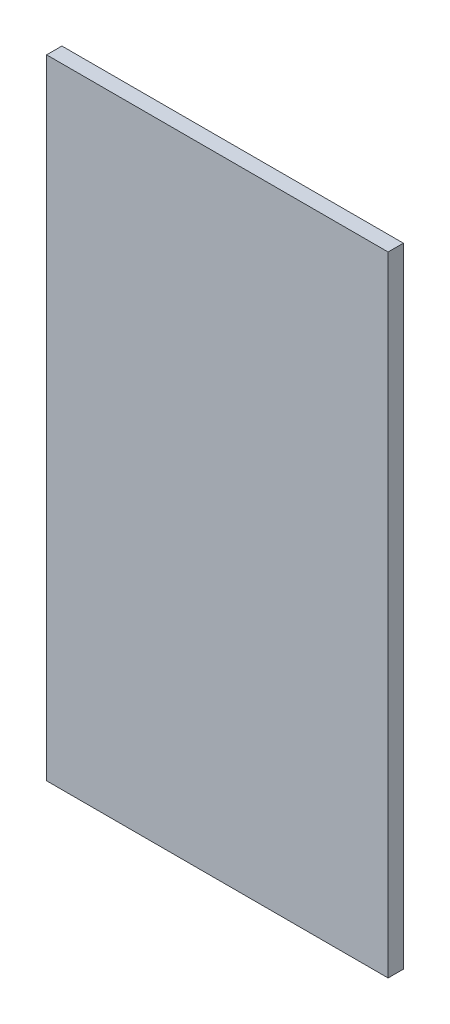
ISO-10303-21;
HEADER;
FILE_DESCRIPTION(('STEP AP214'),'2;1');
FILE_NAME('part.step','',(''),(''),'','','');
FILE_SCHEMA(('AUTOMOTIVE_DESIGN { 1 0 10303 214 1 1 1 1 }'));
ENDSEC;
DATA;
#1=APPLICATION_CONTEXT('core data for automotive mechanical design processes');
#2=APPLICATION_PROTOCOL_DEFINITION('international standard','automotive_design',2000,#1);
#3=PRODUCT_CONTEXT('',#1,'mechanical');
#4=PRODUCT('Part','Part','',(#3));
#5=PRODUCT_RELATED_PRODUCT_CATEGORY('part','',(#4));
#6=PRODUCT_DEFINITION_FORMATION('','',#4);
#7=PRODUCT_DEFINITION_CONTEXT('part definition',#1,'design');
#8=PRODUCT_DEFINITION('design','',#6,#7);
#9=PRODUCT_DEFINITION_SHAPE('','',#8);
#10=(LENGTH_UNIT() NAMED_UNIT(*) SI_UNIT(.MILLI.,.METRE.));
#11=(NAMED_UNIT(*) PLANE_ANGLE_UNIT() SI_UNIT($,.RADIAN.));
#12=(NAMED_UNIT(*) SI_UNIT($,.STERADIAN.) SOLID_ANGLE_UNIT());
#13=UNCERTAINTY_MEASURE_WITH_UNIT(LENGTH_MEASURE(1.E-05),#10,'distance_accuracy_value','');
#14=(GEOMETRIC_REPRESENTATION_CONTEXT(3) GLOBAL_UNCERTAINTY_ASSIGNED_CONTEXT((#13)) GLOBAL_UNIT_ASSIGNED_CONTEXT((#10,
#11,#12)) REPRESENTATION_CONTEXT('',''));
#15=CARTESIAN_POINT('',(0.,0.,0.));
#16=DIRECTION('',(0.,0.,1.));
#17=DIRECTION('',(1.,0.,0.));
#18=AXIS2_PLACEMENT_3D('',#15,#16,#17);
#19=CARTESIAN_POINT('',(0.,0.,-20.));
#20=DIRECTION('',(-1.,0.,0.));
#21=DIRECTION('',(0.,0.,1.));
#22=AXIS2_PLACEMENT_3D('',#19,#20,#21);
#23=PLANE('',#22);
#24=DIRECTION('',(0.,-1.,0.));
#25=VECTOR('',#24,1.);
#26=CARTESIAN_POINT('',(0.,0.,0.));
#27=LINE('',#26,#25);
#28=CARTESIAN_POINT('',(0.,823.,0.));
#29=VERTEX_POINT('',#28);
#30=CARTESIAN_POINT('',(0.,0.,0.));
#31=VERTEX_POINT('',#30);
#32=EDGE_CURVE('E96',#29,#31,#27,.T.);
#33=ORIENTED_EDGE('',*,*,#32,.F.);
#34=DIRECTION('',(0.,0.,1.));
#35=VECTOR('',#34,1.);
#36=CARTESIAN_POINT('',(0.,823.,-20.));
#37=LINE('',#36,#35);
#38=CARTESIAN_POINT('',(0.,823.,-20.));
#39=VERTEX_POINT('',#38);
#40=EDGE_CURVE('E11',#39,#29,#37,.T.);
#41=ORIENTED_EDGE('',*,*,#40,.F.);
#42=DIRECTION('',(0.,-1.,0.));
#43=VECTOR('',#42,1.);
#44=CARTESIAN_POINT('',(0.,0.,-20.));
#45=LINE('',#44,#43);
#46=CARTESIAN_POINT('',(0.,0.,-20.));
#47=VERTEX_POINT('',#46);
#48=EDGE_CURVE('E90',#39,#47,#45,.T.);
#49=ORIENTED_EDGE('',*,*,#48,.T.);
#50=DIRECTION('',(0.,0.,1.));
#51=VECTOR('',#50,1.);
#52=CARTESIAN_POINT('',(0.,0.,-20.));
#53=LINE('',#52,#51);
#54=EDGE_CURVE('E35',#47,#31,#53,.T.);
#55=ORIENTED_EDGE('',*,*,#54,.T.);
#56=EDGE_LOOP('',(#33,#41,#49,#55));
#57=FACE_BOUND('',#56,.T.);
#58=ADVANCED_FACE('F32',(#57),#23,.T.);
#59=CARTESIAN_POINT('',(0.,823.,-20.));
#60=DIRECTION('',(0.,1.,0.));
#61=DIRECTION('',(0.,0.,1.));
#62=AXIS2_PLACEMENT_3D('',#59,#60,#61);
#63=PLANE('',#62);
#64=DIRECTION('',(-1.,0.,0.));
#65=VECTOR('',#64,1.);
#66=CARTESIAN_POINT('',(0.,823.,0.));
#67=LINE('',#66,#65);
#68=CARTESIAN_POINT('',(447.,823.,0.));
#69=VERTEX_POINT('',#68);
#70=EDGE_CURVE('E92',#69,#29,#67,.T.);
#71=ORIENTED_EDGE('',*,*,#70,.F.);
#72=DIRECTION('',(0.,0.,1.));
#73=VECTOR('',#72,1.);
#74=CARTESIAN_POINT('',(447.,823.,-20.));
#75=LINE('',#74,#73);
#76=CARTESIAN_POINT('',(447.,823.,-20.));
#77=VERTEX_POINT('',#76);
#78=EDGE_CURVE('E41',#77,#69,#75,.T.);
#79=ORIENTED_EDGE('',*,*,#78,.F.);
#80=DIRECTION('',(-1.,0.,0.));
#81=VECTOR('',#80,1.);
#82=CARTESIAN_POINT('',(0.,823.,-20.));
#83=LINE('',#82,#81);
#84=EDGE_CURVE('E87',#77,#39,#83,.T.);
#85=ORIENTED_EDGE('',*,*,#84,.T.);
#86=ORIENTED_EDGE('',*,*,#40,.T.);
#87=EDGE_LOOP('',(#71,#79,#85,#86));
#88=FACE_BOUND('',#87,.T.);
#89=ADVANCED_FACE('F106',(#88),#63,.T.);
#90=CARTESIAN_POINT('',(447.,0.,-20.));
#91=DIRECTION('',(1.,0.,0.));
#92=DIRECTION('',(0.,0.,-1.));
#93=AXIS2_PLACEMENT_3D('',#90,#91,#92);
#94=PLANE('',#93);
#95=DIRECTION('',(0.,1.,0.));
#96=VECTOR('',#95,1.);
#97=CARTESIAN_POINT('',(447.,0.,0.));
#98=LINE('',#97,#96);
#99=CARTESIAN_POINT('',(447.,0.,0.));
#100=VERTEX_POINT('',#99);
#101=EDGE_CURVE('E82',#100,#69,#98,.T.);
#102=ORIENTED_EDGE('',*,*,#101,.F.);
#103=DIRECTION('',(0.,0.,1.));
#104=VECTOR('',#103,1.);
#105=CARTESIAN_POINT('',(447.,0.,-20.));
#106=LINE('',#105,#104);
#107=CARTESIAN_POINT('',(447.,0.,-20.));
#108=VERTEX_POINT('',#107);
#109=EDGE_CURVE('E77',#108,#100,#106,.T.);
#110=ORIENTED_EDGE('',*,*,#109,.F.);
#111=DIRECTION('',(0.,1.,0.));
#112=VECTOR('',#111,1.);
#113=CARTESIAN_POINT('',(447.,0.,-20.));
#114=LINE('',#113,#112);
#115=EDGE_CURVE('E80',#108,#77,#114,.T.);
#116=ORIENTED_EDGE('',*,*,#115,.T.);
#117=ORIENTED_EDGE('',*,*,#78,.T.);
#118=EDGE_LOOP('',(#102,#110,#116,#117));
#119=FACE_BOUND('',#118,.T.);
#120=ADVANCED_FACE('F79',(#119),#94,.T.);
#121=CARTESIAN_POINT('',(0.,0.,-20.));
#122=DIRECTION('',(0.,-1.,0.));
#123=DIRECTION('',(0.,0.,-1.));
#124=AXIS2_PLACEMENT_3D('',#121,#122,#123);
#125=PLANE('',#124);
#126=DIRECTION('',(1.,0.,0.));
#127=VECTOR('',#126,1.);
#128=CARTESIAN_POINT('',(0.,0.,0.));
#129=LINE('',#128,#127);
#130=EDGE_CURVE('E99',#31,#100,#129,.T.);
#131=ORIENTED_EDGE('',*,*,#130,.F.);
#132=ORIENTED_EDGE('',*,*,#54,.F.);
#133=DIRECTION('',(1.,0.,0.));
#134=VECTOR('',#133,1.);
#135=CARTESIAN_POINT('',(0.,0.,-20.));
#136=LINE('',#135,#134);
#137=EDGE_CURVE('E86',#47,#108,#136,.T.);
#138=ORIENTED_EDGE('',*,*,#137,.T.);
#139=ORIENTED_EDGE('',*,*,#109,.T.);
#140=EDGE_LOOP('',(#131,#132,#138,#139));
#141=FACE_BOUND('',#140,.T.);
#142=ADVANCED_FACE('F89',(#141),#125,.T.);
#143=CARTESIAN_POINT('',(0.,0.,-20.));
#144=DIRECTION('',(0.,0.,-1.));
#145=DIRECTION('',(-1.,0.,0.));
#146=AXIS2_PLACEMENT_3D('',#143,#144,#145);
#147=PLANE('',#146);
#148=ORIENTED_EDGE('',*,*,#48,.F.);
#149=ORIENTED_EDGE('',*,*,#84,.F.);
#150=ORIENTED_EDGE('',*,*,#115,.F.);
#151=ORIENTED_EDGE('',*,*,#137,.F.);
#152=EDGE_LOOP('',(#148,#149,#150,#151));
#153=FACE_BOUND('',#152,.T.);
#154=ADVANCED_FACE('F85',(#153),#147,.T.);
#155=CARTESIAN_POINT('',(0.,0.,0.));
#156=DIRECTION('',(0.,0.,-1.));
#157=DIRECTION('',(-1.,0.,0.));
#158=AXIS2_PLACEMENT_3D('',#155,#156,#157);
#159=PLANE('',#158);
#160=ORIENTED_EDGE('',*,*,#32,.T.);
#161=ORIENTED_EDGE('',*,*,#130,.T.);
#162=ORIENTED_EDGE('',*,*,#101,.T.);
#163=ORIENTED_EDGE('',*,*,#70,.T.);
#164=EDGE_LOOP('',(#160,#161,#162,#163));
#165=FACE_BOUND('',#164,.T.);
#166=ADVANCED_FACE('F105',(#165),#159,.F.);
#167=CLOSED_SHELL('',(#58,#89,#120,#142,#154,#166));
#168=MANIFOLD_SOLID_BREP('B2',#167);
#169=ADVANCED_BREP_SHAPE_REPRESENTATION('',(#18,#168),#14);
#170=SHAPE_DEFINITION_REPRESENTATION(#9,#169);
ENDSEC;
END-ISO-10303-21;
